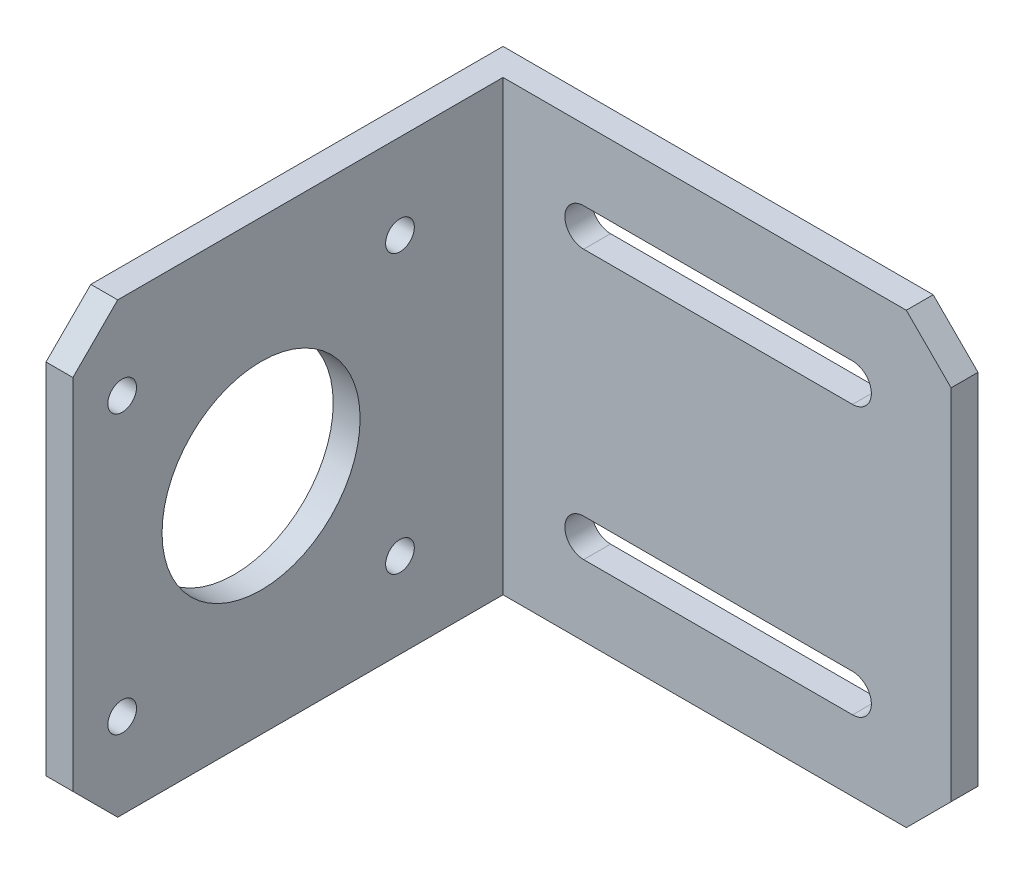
ISO-10303-21;
HEADER;
FILE_DESCRIPTION(('STEP AP214'),'2;1');
FILE_NAME('part.step','',(''),(''),'','','');
FILE_SCHEMA(('AUTOMOTIVE_DESIGN { 1 0 10303 214 1 1 1 1 }'));
ENDSEC;
DATA;
#1=APPLICATION_CONTEXT('core data for automotive mechanical design processes');
#2=APPLICATION_PROTOCOL_DEFINITION('international standard','automotive_design',2000,#1);
#3=PRODUCT_CONTEXT('',#1,'mechanical');
#4=PRODUCT('Part','Part','',(#3));
#5=PRODUCT_RELATED_PRODUCT_CATEGORY('part','',(#4));
#6=PRODUCT_DEFINITION_FORMATION('','',#4);
#7=PRODUCT_DEFINITION_CONTEXT('part definition',#1,'design');
#8=PRODUCT_DEFINITION('design','',#6,#7);
#9=PRODUCT_DEFINITION_SHAPE('','',#8);
#10=(LENGTH_UNIT() NAMED_UNIT(*) SI_UNIT(.MILLI.,.METRE.));
#11=(NAMED_UNIT(*) PLANE_ANGLE_UNIT() SI_UNIT($,.RADIAN.));
#12=(NAMED_UNIT(*) SI_UNIT($,.STERADIAN.) SOLID_ANGLE_UNIT());
#13=UNCERTAINTY_MEASURE_WITH_UNIT(LENGTH_MEASURE(1.E-05),#10,'distance_accuracy_value','');
#14=(GEOMETRIC_REPRESENTATION_CONTEXT(3) GLOBAL_UNCERTAINTY_ASSIGNED_CONTEXT((#13)) GLOBAL_UNIT_ASSIGNED_CONTEXT((#10,
#11,#12)) REPRESENTATION_CONTEXT('',''));
#15=CARTESIAN_POINT('',(0.,0.,0.));
#16=DIRECTION('',(0.,0.,1.));
#17=DIRECTION('',(1.,0.,0.));
#18=AXIS2_PLACEMENT_3D('',#15,#16,#17);
#19=CARTESIAN_POINT('',(0.,0.,3.));
#20=DIRECTION('',(0.,0.,-1.));
#21=DIRECTION('',(-1.,0.,0.));
#22=AXIS2_PLACEMENT_3D('',#19,#20,#21);
#23=PLANE('',#22);
#24=CARTESIAN_POINT('',(12.,10.,3.));
#25=DIRECTION('',(0.,0.,1.));
#26=DIRECTION('',(-1.,0.,0.));
#27=AXIS2_PLACEMENT_3D('',#24,#25,#26);
#28=CIRCLE('',#27,2.1);
#29=CARTESIAN_POINT('',(12.,12.1,3.));
#30=VERTEX_POINT('',#29);
#31=CARTESIAN_POINT('',(12.,7.9,3.));
#32=VERTEX_POINT('',#31);
#33=EDGE_CURVE('E168',#30,#32,#28,.T.);
#34=ORIENTED_EDGE('',*,*,#33,.F.);
#35=DIRECTION('',(-1.,0.,0.));
#36=VECTOR('',#35,1.);
#37=CARTESIAN_POINT('',(12.,12.1,3.));
#38=LINE('',#37,#36);
#39=CARTESIAN_POINT('',(42.,12.1,3.));
#40=VERTEX_POINT('',#39);
#41=EDGE_CURVE('E194',#40,#30,#38,.T.);
#42=ORIENTED_EDGE('',*,*,#41,.F.);
#43=CARTESIAN_POINT('',(42.,10.,3.));
#44=DIRECTION('',(0.,0.,1.));
#45=DIRECTION('',(-1.,0.,0.));
#46=AXIS2_PLACEMENT_3D('',#43,#44,#45);
#47=CIRCLE('',#46,2.1);
#48=CARTESIAN_POINT('',(42.,7.9,3.));
#49=VERTEX_POINT('',#48);
#50=EDGE_CURVE('E192',#49,#40,#47,.T.);
#51=ORIENTED_EDGE('',*,*,#50,.F.);
#52=DIRECTION('',(1.,0.,0.));
#53=VECTOR('',#52,1.);
#54=CARTESIAN_POINT('',(12.,7.9,3.));
#55=LINE('',#54,#53);
#56=EDGE_CURVE('E178',#32,#49,#55,.T.);
#57=ORIENTED_EDGE('',*,*,#56,.F.);
#58=EDGE_LOOP('',(#34,#42,#51,#57));
#59=FACE_BOUND('',#58,.T.);
#60=CARTESIAN_POINT('',(12.,40.,3.));
#61=DIRECTION('',(0.,0.,1.));
#62=DIRECTION('',(1.,0.,0.));
#63=AXIS2_PLACEMENT_3D('',#60,#61,#62);
#64=CIRCLE('',#63,2.1);
#65=CARTESIAN_POINT('',(12.,42.1,3.));
#66=VERTEX_POINT('',#65);
#67=CARTESIAN_POINT('',(12.,37.9,3.));
#68=VERTEX_POINT('',#67);
#69=EDGE_CURVE('E212',#66,#68,#64,.T.);
#70=ORIENTED_EDGE('',*,*,#69,.F.);
#71=DIRECTION('',(-1.,0.,0.));
#72=VECTOR('',#71,1.);
#73=CARTESIAN_POINT('',(12.,42.1,3.));
#74=LINE('',#73,#72);
#75=CARTESIAN_POINT('',(42.,42.1,3.));
#76=VERTEX_POINT('',#75);
#77=EDGE_CURVE('E220',#76,#66,#74,.T.);
#78=ORIENTED_EDGE('',*,*,#77,.F.);
#79=CARTESIAN_POINT('',(42.,40.,3.));
#80=DIRECTION('',(0.,0.,1.));
#81=DIRECTION('',(1.,0.,0.));
#82=AXIS2_PLACEMENT_3D('',#79,#80,#81);
#83=CIRCLE('',#82,2.1);
#84=CARTESIAN_POINT('',(42.,37.9,3.));
#85=VERTEX_POINT('',#84);
#86=EDGE_CURVE('E217',#85,#76,#83,.T.);
#87=ORIENTED_EDGE('',*,*,#86,.F.);
#88=DIRECTION('',(1.,0.,0.));
#89=VECTOR('',#88,1.);
#90=CARTESIAN_POINT('',(12.,37.9,3.));
#91=LINE('',#90,#89);
#92=EDGE_CURVE('E214',#68,#85,#91,.T.);
#93=ORIENTED_EDGE('',*,*,#92,.F.);
#94=EDGE_LOOP('',(#70,#78,#87,#93));
#95=FACE_BOUND('',#94,.T.);
#96=DIRECTION('',(0.,1.,0.));
#97=VECTOR('',#96,1.);
#98=CARTESIAN_POINT('',(53.,0.,3.));
#99=LINE('',#98,#97);
#100=CARTESIAN_POINT('',(53.,4.99999999999999,3.));
#101=VERTEX_POINT('',#100);
#102=CARTESIAN_POINT('',(53.,45.,3.));
#103=VERTEX_POINT('',#102);
#104=EDGE_CURVE('E246',#101,#103,#99,.T.);
#105=ORIENTED_EDGE('',*,*,#104,.T.);
#106=DIRECTION('',(0.707106781186547,-0.707106781186549,0.));
#107=VECTOR('',#106,1.);
#108=CARTESIAN_POINT('',(48.,50.,3.));
#109=LINE('',#108,#107);
#110=CARTESIAN_POINT('',(48.,50.,3.));
#111=VERTEX_POINT('',#110);
#112=EDGE_CURVE('E282',#103,#111,#109,.F.);
#113=ORIENTED_EDGE('',*,*,#112,.T.);
#114=DIRECTION('',(-1.,0.,0.));
#115=VECTOR('',#114,1.);
#116=CARTESIAN_POINT('',(0.,50.,3.));
#117=LINE('',#116,#115);
#118=CARTESIAN_POINT('',(3.,50.,3.));
#119=VERTEX_POINT('',#118);
#120=EDGE_CURVE('E250',#111,#119,#117,.T.);
#121=ORIENTED_EDGE('',*,*,#120,.T.);
#122=DIRECTION('',(0.,1.,0.));
#123=VECTOR('',#122,1.);
#124=CARTESIAN_POINT('',(3.,0.,3.));
#125=LINE('',#124,#123);
#126=CARTESIAN_POINT('',(3.,0.,3.));
#127=VERTEX_POINT('',#126);
#128=EDGE_CURVE('E201',#127,#119,#125,.T.);
#129=ORIENTED_EDGE('',*,*,#128,.F.);
#130=DIRECTION('',(1.,0.,0.));
#131=VECTOR('',#130,1.);
#132=CARTESIAN_POINT('',(0.,0.,3.));
#133=LINE('',#132,#131);
#134=CARTESIAN_POINT('',(48.,0.,3.));
#135=VERTEX_POINT('',#134);
#136=EDGE_CURVE('E243',#127,#135,#133,.T.);
#137=ORIENTED_EDGE('',*,*,#136,.T.);
#138=DIRECTION('',(-0.707106781186549,-0.707106781186547,0.));
#139=VECTOR('',#138,1.);
#140=CARTESIAN_POINT('',(53.,4.99999999999999,3.));
#141=LINE('',#140,#139);
#142=EDGE_CURVE('E280',#135,#101,#141,.F.);
#143=ORIENTED_EDGE('',*,*,#142,.T.);
#144=EDGE_LOOP('',(#105,#113,#121,#129,#137,#143));
#145=FACE_BOUND('',#144,.T.);
#146=ADVANCED_FACE('F41',(#59,#95,#145),#23,.F.);
#147=CARTESIAN_POINT('',(0.,0.,0.));
#148=DIRECTION('',(0.,0.,-1.));
#149=DIRECTION('',(-1.,0.,0.));
#150=AXIS2_PLACEMENT_3D('',#147,#148,#149);
#151=PLANE('',#150);
#152=DIRECTION('',(-1.,0.,0.));
#153=VECTOR('',#152,1.);
#154=CARTESIAN_POINT('',(0.,50.,0.));
#155=LINE('',#154,#153);
#156=CARTESIAN_POINT('',(48.,50.,0.));
#157=VERTEX_POINT('',#156);
#158=CARTESIAN_POINT('',(0.,50.,0.));
#159=VERTEX_POINT('',#158);
#160=EDGE_CURVE('E247',#157,#159,#155,.T.);
#161=ORIENTED_EDGE('',*,*,#160,.F.);
#162=DIRECTION('',(-0.707106781186547,0.707106781186549,0.));
#163=VECTOR('',#162,1.);
#164=CARTESIAN_POINT('',(49.0000000000001,48.9999999999999,0.));
#165=LINE('',#164,#163);
#166=CARTESIAN_POINT('',(53.,45.,0.));
#167=VERTEX_POINT('',#166);
#168=EDGE_CURVE('E273',#157,#167,#165,.F.);
#169=ORIENTED_EDGE('',*,*,#168,.T.);
#170=DIRECTION('',(0.,1.,0.));
#171=VECTOR('',#170,1.);
#172=CARTESIAN_POINT('',(53.,0.,0.));
#173=LINE('',#172,#171);
#174=CARTESIAN_POINT('',(53.,4.99999999999999,0.));
#175=VERTEX_POINT('',#174);
#176=EDGE_CURVE('E258',#175,#167,#173,.T.);
#177=ORIENTED_EDGE('',*,*,#176,.F.);
#178=DIRECTION('',(0.707106781186549,0.707106781186547,0.));
#179=VECTOR('',#178,1.);
#180=CARTESIAN_POINT('',(23.9999999999999,-24.,0.));
#181=LINE('',#180,#179);
#182=CARTESIAN_POINT('',(48.,0.,0.));
#183=VERTEX_POINT('',#182);
#184=EDGE_CURVE('E271',#175,#183,#181,.F.);
#185=ORIENTED_EDGE('',*,*,#184,.T.);
#186=DIRECTION('',(1.,0.,0.));
#187=VECTOR('',#186,1.);
#188=CARTESIAN_POINT('',(0.,0.,0.));
#189=LINE('',#188,#187);
#190=CARTESIAN_POINT('',(0.,0.,0.));
#191=VERTEX_POINT('',#190);
#192=EDGE_CURVE('E255',#191,#183,#189,.T.);
#193=ORIENTED_EDGE('',*,*,#192,.F.);
#194=DIRECTION('',(0.,-1.,0.));
#195=VECTOR('',#194,1.);
#196=CARTESIAN_POINT('',(0.,0.,0.));
#197=LINE('',#196,#195);
#198=EDGE_CURVE('E242',#159,#191,#197,.T.);
#199=ORIENTED_EDGE('',*,*,#198,.F.);
#200=EDGE_LOOP('',(#161,#169,#177,#185,#193,#199));
#201=FACE_BOUND('',#200,.T.);
#202=DIRECTION('',(-1.,0.,0.));
#203=VECTOR('',#202,1.);
#204=CARTESIAN_POINT('',(12.,42.1,0.));
#205=LINE('',#204,#203);
#206=CARTESIAN_POINT('',(42.,42.1,0.));
#207=VERTEX_POINT('',#206);
#208=CARTESIAN_POINT('',(12.,42.1,0.));
#209=VERTEX_POINT('',#208);
#210=EDGE_CURVE('E215',#207,#209,#205,.T.);
#211=ORIENTED_EDGE('',*,*,#210,.T.);
#212=CARTESIAN_POINT('',(12.,40.,0.));
#213=DIRECTION('',(0.,0.,1.));
#214=DIRECTION('',(1.,0.,0.));
#215=AXIS2_PLACEMENT_3D('',#212,#213,#214);
#216=CIRCLE('',#215,2.1);
#217=CARTESIAN_POINT('',(12.,37.9,0.));
#218=VERTEX_POINT('',#217);
#219=EDGE_CURVE('E186',#209,#218,#216,.T.);
#220=ORIENTED_EDGE('',*,*,#219,.T.);
#221=DIRECTION('',(1.,0.,0.));
#222=VECTOR('',#221,1.);
#223=CARTESIAN_POINT('',(12.,37.9,0.));
#224=LINE('',#223,#222);
#225=CARTESIAN_POINT('',(42.,37.9,0.));
#226=VERTEX_POINT('',#225);
#227=EDGE_CURVE('E225',#218,#226,#224,.T.);
#228=ORIENTED_EDGE('',*,*,#227,.T.);
#229=CARTESIAN_POINT('',(42.,40.,0.));
#230=DIRECTION('',(0.,0.,1.));
#231=DIRECTION('',(1.,0.,0.));
#232=AXIS2_PLACEMENT_3D('',#229,#230,#231);
#233=CIRCLE('',#232,2.1);
#234=EDGE_CURVE('E228',#226,#207,#233,.T.);
#235=ORIENTED_EDGE('',*,*,#234,.T.);
#236=EDGE_LOOP('',(#211,#220,#228,#235));
#237=FACE_BOUND('',#236,.T.);
#238=DIRECTION('',(-1.,0.,0.));
#239=VECTOR('',#238,1.);
#240=CARTESIAN_POINT('',(12.,12.1,0.));
#241=LINE('',#240,#239);
#242=CARTESIAN_POINT('',(42.,12.1,0.));
#243=VERTEX_POINT('',#242);
#244=CARTESIAN_POINT('',(12.,12.1,0.));
#245=VERTEX_POINT('',#244);
#246=EDGE_CURVE('E179',#243,#245,#241,.T.);
#247=ORIENTED_EDGE('',*,*,#246,.T.);
#248=CARTESIAN_POINT('',(12.,10.,0.));
#249=DIRECTION('',(0.,0.,1.));
#250=DIRECTION('',(-1.,0.,0.));
#251=AXIS2_PLACEMENT_3D('',#248,#249,#250);
#252=CIRCLE('',#251,2.1);
#253=CARTESIAN_POINT('',(12.,7.9,0.));
#254=VERTEX_POINT('',#253);
#255=EDGE_CURVE('E199',#245,#254,#252,.T.);
#256=ORIENTED_EDGE('',*,*,#255,.T.);
#257=DIRECTION('',(1.,0.,0.));
#258=VECTOR('',#257,1.);
#259=CARTESIAN_POINT('',(12.,7.9,0.));
#260=LINE('',#259,#258);
#261=CARTESIAN_POINT('',(42.,7.9,0.));
#262=VERTEX_POINT('',#261);
#263=EDGE_CURVE('E185',#254,#262,#260,.T.);
#264=ORIENTED_EDGE('',*,*,#263,.T.);
#265=CARTESIAN_POINT('',(42.,10.,0.));
#266=DIRECTION('',(0.,0.,1.));
#267=DIRECTION('',(-1.,0.,0.));
#268=AXIS2_PLACEMENT_3D('',#265,#266,#267);
#269=CIRCLE('',#268,2.1);
#270=EDGE_CURVE('E203',#262,#243,#269,.T.);
#271=ORIENTED_EDGE('',*,*,#270,.T.);
#272=EDGE_LOOP('',(#247,#256,#264,#271));
#273=FACE_BOUND('',#272,.T.);
#274=ADVANCED_FACE('F364',(#201,#237,#273),#151,.T.);
#275=CARTESIAN_POINT('',(0.,0.,3.));
#276=DIRECTION('',(1.,0.,0.));
#277=DIRECTION('',(0.,0.,-1.));
#278=AXIS2_PLACEMENT_3D('',#275,#276,#277);
#279=PLANE('',#278);
#280=DIRECTION('',(0.,0.,-1.));
#281=VECTOR('',#280,1.);
#282=CARTESIAN_POINT('',(0.,0.,3.));
#283=LINE('',#282,#281);
#284=CARTESIAN_POINT('',(0.,0.,46.));
#285=VERTEX_POINT('',#284);
#286=EDGE_CURVE('E264',#285,#191,#283,.T.);
#287=ORIENTED_EDGE('',*,*,#286,.F.);
#288=DIRECTION('',(0.,0.707106781186549,0.707106781186547));
#289=VECTOR('',#288,1.);
#290=CARTESIAN_POINT('',(0.,0.,46.));
#291=LINE('',#290,#289);
#292=CARTESIAN_POINT('',(0.,5.00000000000003,51.));
#293=VERTEX_POINT('',#292);
#294=EDGE_CURVE('E291',#285,#293,#291,.T.);
#295=ORIENTED_EDGE('',*,*,#294,.T.);
#296=DIRECTION('',(0.,1.,0.));
#297=VECTOR('',#296,1.);
#298=CARTESIAN_POINT('',(0.,50.,51.));
#299=LINE('',#298,#297);
#300=CARTESIAN_POINT('',(0.,45.,51.));
#301=VERTEX_POINT('',#300);
#302=EDGE_CURVE('E299',#293,#301,#299,.T.);
#303=ORIENTED_EDGE('',*,*,#302,.T.);
#304=DIRECTION('',(0.,0.707106781186546,-0.707106781186549));
#305=VECTOR('',#304,1.);
#306=CARTESIAN_POINT('',(0.,45.,51.));
#307=LINE('',#306,#305);
#308=CARTESIAN_POINT('',(0.,50.,46.));
#309=VERTEX_POINT('',#308);
#310=EDGE_CURVE('E289',#301,#309,#307,.T.);
#311=ORIENTED_EDGE('',*,*,#310,.T.);
#312=DIRECTION('',(0.,0.,-1.));
#313=VECTOR('',#312,1.);
#314=CARTESIAN_POINT('',(0.,50.,3.));
#315=LINE('',#314,#313);
#316=EDGE_CURVE('E252',#309,#159,#315,.T.);
#317=ORIENTED_EDGE('',*,*,#316,.T.);
#318=ORIENTED_EDGE('',*,*,#198,.T.);
#319=EDGE_LOOP('',(#287,#295,#303,#311,#317,#318));
#320=FACE_BOUND('',#319,.T.);
#321=CARTESIAN_POINT('',(0.,25.,30.));
#322=DIRECTION('',(-1.,0.,0.));
#323=DIRECTION('',(0.,0.,1.));
#324=AXIS2_PLACEMENT_3D('',#321,#322,#323);
#325=CIRCLE('',#324,11.05);
#326=CARTESIAN_POINT('',(0.,25.,41.05));
#327=VERTEX_POINT('',#326);
#328=EDGE_CURVE('E313',#327,#327,#325,.T.);
#329=ORIENTED_EDGE('',*,*,#328,.F.);
#330=EDGE_LOOP('',(#329));
#331=FACE_BOUND('',#330,.T.);
#332=CARTESIAN_POINT('',(0.,40.5,45.5));
#333=DIRECTION('',(-1.,0.,0.));
#334=DIRECTION('',(0.,0.,1.));
#335=AXIS2_PLACEMENT_3D('',#332,#333,#334);
#336=CIRCLE('',#335,1.6);
#337=CARTESIAN_POINT('',(0.,40.5,47.1));
#338=VERTEX_POINT('',#337);
#339=EDGE_CURVE('E327',#338,#338,#336,.T.);
#340=ORIENTED_EDGE('',*,*,#339,.F.);
#341=EDGE_LOOP('',(#340));
#342=FACE_BOUND('',#341,.T.);
#343=CARTESIAN_POINT('',(0.,9.49999999999996,45.5000000000004));
#344=DIRECTION('',(-1.,0.,0.));
#345=DIRECTION('',(0.,0.,1.));
#346=AXIS2_PLACEMENT_3D('',#343,#344,#345);
#347=CIRCLE('',#346,1.6);
#348=CARTESIAN_POINT('',(0.,9.49999999999996,47.1000000000004));
#349=VERTEX_POINT('',#348);
#350=EDGE_CURVE('E333',#349,#349,#347,.T.);
#351=ORIENTED_EDGE('',*,*,#350,.F.);
#352=EDGE_LOOP('',(#351));
#353=FACE_BOUND('',#352,.T.);
#354=CARTESIAN_POINT('',(0.,9.49999999999968,14.5000000000003));
#355=DIRECTION('',(-1.,0.,0.));
#356=DIRECTION('',(0.,0.,1.));
#357=AXIS2_PLACEMENT_3D('',#354,#355,#356);
#358=CIRCLE('',#357,1.6);
#359=CARTESIAN_POINT('',(0.,9.49999999999968,16.1000000000003));
#360=VERTEX_POINT('',#359);
#361=EDGE_CURVE('E339',#360,#360,#358,.T.);
#362=ORIENTED_EDGE('',*,*,#361,.F.);
#363=EDGE_LOOP('',(#362));
#364=FACE_BOUND('',#363,.T.);
#365=CARTESIAN_POINT('',(0.,40.4999999999997,14.5000000000002));
#366=DIRECTION('',(-1.,0.,0.));
#367=DIRECTION('',(0.,0.,1.));
#368=AXIS2_PLACEMENT_3D('',#365,#366,#367);
#369=CIRCLE('',#368,1.6);
#370=CARTESIAN_POINT('',(0.,40.4999999999997,16.1000000000002));
#371=VERTEX_POINT('',#370);
#372=EDGE_CURVE('E345',#371,#371,#369,.T.);
#373=ORIENTED_EDGE('',*,*,#372,.F.);
#374=EDGE_LOOP('',(#373));
#375=FACE_BOUND('',#374,.T.);
#376=ADVANCED_FACE('F304',(#320,#331,#342,#353,#364,#375),#279,.F.);
#377=CARTESIAN_POINT('',(0.,0.,3.));
#378=DIRECTION('',(0.,1.,0.));
#379=DIRECTION('',(0.,0.,1.));
#380=AXIS2_PLACEMENT_3D('',#377,#378,#379);
#381=PLANE('',#380);
#382=ORIENTED_EDGE('',*,*,#192,.T.);
#383=DIRECTION('',(0.,0.,1.));
#384=VECTOR('',#383,1.);
#385=CARTESIAN_POINT('',(48.,0.,3.));
#386=LINE('',#385,#384);
#387=EDGE_CURVE('E287',#183,#135,#386,.T.);
#388=ORIENTED_EDGE('',*,*,#387,.T.);
#389=ORIENTED_EDGE('',*,*,#136,.F.);
#390=DIRECTION('',(0.,0.,1.));
#391=VECTOR('',#390,1.);
#392=CARTESIAN_POINT('',(3.,0.,0.));
#393=LINE('',#392,#391);
#394=CARTESIAN_POINT('',(3.,0.,46.));
#395=VERTEX_POINT('',#394);
#396=EDGE_CURVE('E307',#127,#395,#393,.T.);
#397=ORIENTED_EDGE('',*,*,#396,.T.);
#398=DIRECTION('',(-1.,0.,0.));
#399=VECTOR('',#398,1.);
#400=CARTESIAN_POINT('',(0.,0.,46.));
#401=LINE('',#400,#399);
#402=EDGE_CURVE('E284',#395,#285,#401,.T.);
#403=ORIENTED_EDGE('',*,*,#402,.T.);
#404=ORIENTED_EDGE('',*,*,#286,.T.);
#405=EDGE_LOOP('',(#382,#388,#389,#397,#403,#404));
#406=FACE_BOUND('',#405,.T.);
#407=ADVANCED_FACE('F363',(#406),#381,.F.);
#408=CARTESIAN_POINT('',(53.,0.,3.));
#409=DIRECTION('',(-1.,0.,0.));
#410=DIRECTION('',(0.,0.,1.));
#411=AXIS2_PLACEMENT_3D('',#408,#409,#410);
#412=PLANE('',#411);
#413=ORIENTED_EDGE('',*,*,#176,.T.);
#414=DIRECTION('',(0.,0.,1.));
#415=VECTOR('',#414,1.);
#416=CARTESIAN_POINT('',(53.,45.,3.));
#417=LINE('',#416,#415);
#418=EDGE_CURVE('E278',#167,#103,#417,.T.);
#419=ORIENTED_EDGE('',*,*,#418,.T.);
#420=ORIENTED_EDGE('',*,*,#104,.F.);
#421=DIRECTION('',(0.,0.,-1.));
#422=VECTOR('',#421,1.);
#423=CARTESIAN_POINT('',(53.,4.99999999999999,3.));
#424=LINE('',#423,#422);
#425=EDGE_CURVE('E275',#101,#175,#424,.T.);
#426=ORIENTED_EDGE('',*,*,#425,.T.);
#427=EDGE_LOOP('',(#413,#419,#420,#426));
#428=FACE_BOUND('',#427,.T.);
#429=ADVANCED_FACE('F370',(#428),#412,.F.);
#430=CARTESIAN_POINT('',(0.,50.,3.));
#431=DIRECTION('',(0.,-1.,0.));
#432=DIRECTION('',(0.,0.,-1.));
#433=AXIS2_PLACEMENT_3D('',#430,#431,#432);
#434=PLANE('',#433);
#435=ORIENTED_EDGE('',*,*,#120,.F.);
#436=DIRECTION('',(0.,0.,-1.));
#437=VECTOR('',#436,1.);
#438=CARTESIAN_POINT('',(48.,50.,3.));
#439=LINE('',#438,#437);
#440=EDGE_CURVE('E268',#111,#157,#439,.T.);
#441=ORIENTED_EDGE('',*,*,#440,.T.);
#442=ORIENTED_EDGE('',*,*,#160,.T.);
#443=ORIENTED_EDGE('',*,*,#316,.F.);
#444=DIRECTION('',(1.,0.,0.));
#445=VECTOR('',#444,1.);
#446=CARTESIAN_POINT('',(3.,50.,46.));
#447=LINE('',#446,#445);
#448=CARTESIAN_POINT('',(3.,50.,46.));
#449=VERTEX_POINT('',#448);
#450=EDGE_CURVE('E266',#309,#449,#447,.T.);
#451=ORIENTED_EDGE('',*,*,#450,.T.);
#452=DIRECTION('',(0.,0.,-1.));
#453=VECTOR('',#452,1.);
#454=CARTESIAN_POINT('',(3.,50.,0.));
#455=LINE('',#454,#453);
#456=EDGE_CURVE('E316',#449,#119,#455,.T.);
#457=ORIENTED_EDGE('',*,*,#456,.T.);
#458=EDGE_LOOP('',(#435,#441,#442,#443,#451,#457));
#459=FACE_BOUND('',#458,.T.);
#460=ADVANCED_FACE('F384',(#459),#434,.F.);
#461=CARTESIAN_POINT('',(12.,40.,3.));
#462=DIRECTION('',(0.,0.,-1.));
#463=DIRECTION('',(-1.,0.,0.));
#464=AXIS2_PLACEMENT_3D('',#461,#462,#463);
#465=CYLINDRICAL_SURFACE('',#464,2.1);
#466=ORIENTED_EDGE('',*,*,#219,.F.);
#467=DIRECTION('',(0.,0.,-1.));
#468=VECTOR('',#467,1.);
#469=CARTESIAN_POINT('',(12.,42.1,3.));
#470=LINE('',#469,#468);
#471=EDGE_CURVE('E222',#66,#209,#470,.T.);
#472=ORIENTED_EDGE('',*,*,#471,.F.);
#473=ORIENTED_EDGE('',*,*,#69,.T.);
#474=DIRECTION('',(0.,0.,-1.));
#475=VECTOR('',#474,1.);
#476=CARTESIAN_POINT('',(12.,37.9,3.));
#477=LINE('',#476,#475);
#478=EDGE_CURVE('E239',#68,#218,#477,.T.);
#479=ORIENTED_EDGE('',*,*,#478,.T.);
#480=EDGE_LOOP('',(#466,#472,#473,#479));
#481=FACE_BOUND('',#480,.T.);
#482=ADVANCED_FACE('F381',(#481),#465,.F.);
#483=CARTESIAN_POINT('',(12.,37.9,3.));
#484=DIRECTION('',(0.,1.,0.));
#485=DIRECTION('',(0.,0.,1.));
#486=AXIS2_PLACEMENT_3D('',#483,#484,#485);
#487=PLANE('',#486);
#488=ORIENTED_EDGE('',*,*,#227,.F.);
#489=ORIENTED_EDGE('',*,*,#478,.F.);
#490=ORIENTED_EDGE('',*,*,#92,.T.);
#491=DIRECTION('',(0.,0.,-1.));
#492=VECTOR('',#491,1.);
#493=CARTESIAN_POINT('',(42.,37.9,3.));
#494=LINE('',#493,#492);
#495=EDGE_CURVE('E237',#85,#226,#494,.T.);
#496=ORIENTED_EDGE('',*,*,#495,.T.);
#497=EDGE_LOOP('',(#488,#489,#490,#496));
#498=FACE_BOUND('',#497,.T.);
#499=ADVANCED_FACE('F554',(#498),#487,.T.);
#500=CARTESIAN_POINT('',(42.,40.,3.));
#501=DIRECTION('',(0.,0.,-1.));
#502=DIRECTION('',(-1.,0.,0.));
#503=AXIS2_PLACEMENT_3D('',#500,#501,#502);
#504=CYLINDRICAL_SURFACE('',#503,2.1);
#505=ORIENTED_EDGE('',*,*,#234,.F.);
#506=ORIENTED_EDGE('',*,*,#495,.F.);
#507=ORIENTED_EDGE('',*,*,#86,.T.);
#508=DIRECTION('',(0.,0.,-1.));
#509=VECTOR('',#508,1.);
#510=CARTESIAN_POINT('',(42.,42.1,3.));
#511=LINE('',#510,#509);
#512=EDGE_CURVE('E235',#76,#207,#511,.T.);
#513=ORIENTED_EDGE('',*,*,#512,.T.);
#514=EDGE_LOOP('',(#505,#506,#507,#513));
#515=FACE_BOUND('',#514,.T.);
#516=ADVANCED_FACE('F545',(#515),#504,.F.);
#517=CARTESIAN_POINT('',(12.,42.1,3.));
#518=DIRECTION('',(0.,-1.,0.));
#519=DIRECTION('',(0.,0.,-1.));
#520=AXIS2_PLACEMENT_3D('',#517,#518,#519);
#521=PLANE('',#520);
#522=ORIENTED_EDGE('',*,*,#210,.F.);
#523=ORIENTED_EDGE('',*,*,#512,.F.);
#524=ORIENTED_EDGE('',*,*,#77,.T.);
#525=ORIENTED_EDGE('',*,*,#471,.T.);
#526=EDGE_LOOP('',(#522,#523,#524,#525));
#527=FACE_BOUND('',#526,.T.);
#528=ADVANCED_FACE('F537',(#527),#521,.T.);
#529=CARTESIAN_POINT('',(12.,10.,3.));
#530=DIRECTION('',(0.,0.,-1.));
#531=DIRECTION('',(-1.,0.,0.));
#532=AXIS2_PLACEMENT_3D('',#529,#530,#531);
#533=CYLINDRICAL_SURFACE('',#532,2.1);
#534=ORIENTED_EDGE('',*,*,#255,.F.);
#535=DIRECTION('',(0.,0.,-1.));
#536=VECTOR('',#535,1.);
#537=CARTESIAN_POINT('',(12.,12.1,3.));
#538=LINE('',#537,#536);
#539=EDGE_CURVE('E174',#30,#245,#538,.T.);
#540=ORIENTED_EDGE('',*,*,#539,.F.);
#541=ORIENTED_EDGE('',*,*,#33,.T.);
#542=DIRECTION('',(0.,0.,-1.));
#543=VECTOR('',#542,1.);
#544=CARTESIAN_POINT('',(12.,7.9,3.));
#545=LINE('',#544,#543);
#546=EDGE_CURVE('E171',#32,#254,#545,.T.);
#547=ORIENTED_EDGE('',*,*,#546,.T.);
#548=EDGE_LOOP('',(#534,#540,#541,#547));
#549=FACE_BOUND('',#548,.T.);
#550=ADVANCED_FACE('F170',(#549),#533,.F.);
#551=CARTESIAN_POINT('',(12.,7.9,3.));
#552=DIRECTION('',(0.,1.,0.));
#553=DIRECTION('',(0.,0.,1.));
#554=AXIS2_PLACEMENT_3D('',#551,#552,#553);
#555=PLANE('',#554);
#556=ORIENTED_EDGE('',*,*,#263,.F.);
#557=ORIENTED_EDGE('',*,*,#546,.F.);
#558=ORIENTED_EDGE('',*,*,#56,.T.);
#559=DIRECTION('',(0.,0.,-1.));
#560=VECTOR('',#559,1.);
#561=CARTESIAN_POINT('',(42.,7.9,3.));
#562=LINE('',#561,#560);
#563=EDGE_CURVE('E187',#49,#262,#562,.T.);
#564=ORIENTED_EDGE('',*,*,#563,.T.);
#565=EDGE_LOOP('',(#556,#557,#558,#564));
#566=FACE_BOUND('',#565,.T.);
#567=ADVANCED_FACE('F182',(#566),#555,.T.);
#568=CARTESIAN_POINT('',(42.,10.,3.));
#569=DIRECTION('',(0.,0.,-1.));
#570=DIRECTION('',(-1.,0.,0.));
#571=AXIS2_PLACEMENT_3D('',#568,#569,#570);
#572=CYLINDRICAL_SURFACE('',#571,2.1);
#573=ORIENTED_EDGE('',*,*,#270,.F.);
#574=ORIENTED_EDGE('',*,*,#563,.F.);
#575=ORIENTED_EDGE('',*,*,#50,.T.);
#576=DIRECTION('',(0.,0.,-1.));
#577=VECTOR('',#576,1.);
#578=CARTESIAN_POINT('',(42.,12.1,3.));
#579=LINE('',#578,#577);
#580=EDGE_CURVE('E209',#40,#243,#579,.T.);
#581=ORIENTED_EDGE('',*,*,#580,.T.);
#582=EDGE_LOOP('',(#573,#574,#575,#581));
#583=FACE_BOUND('',#582,.T.);
#584=ADVANCED_FACE('F513',(#583),#572,.F.);
#585=CARTESIAN_POINT('',(12.,12.1,3.));
#586=DIRECTION('',(0.,-1.,0.));
#587=DIRECTION('',(0.,0.,-1.));
#588=AXIS2_PLACEMENT_3D('',#585,#586,#587);
#589=PLANE('',#588);
#590=ORIENTED_EDGE('',*,*,#246,.F.);
#591=ORIENTED_EDGE('',*,*,#580,.F.);
#592=ORIENTED_EDGE('',*,*,#41,.T.);
#593=ORIENTED_EDGE('',*,*,#539,.T.);
#594=EDGE_LOOP('',(#590,#591,#592,#593));
#595=FACE_BOUND('',#594,.T.);
#596=ADVANCED_FACE('F499',(#595),#589,.T.);
#597=CARTESIAN_POINT('',(3.,0.,0.));
#598=DIRECTION('',(-1.,0.,0.));
#599=DIRECTION('',(0.,0.,1.));
#600=AXIS2_PLACEMENT_3D('',#597,#598,#599);
#601=PLANE('',#600);
#602=CARTESIAN_POINT('',(3.,40.4999999999997,14.5000000000002));
#603=DIRECTION('',(-1.,0.,0.));
#604=DIRECTION('',(0.,0.,1.));
#605=AXIS2_PLACEMENT_3D('',#602,#603,#604);
#606=CIRCLE('',#605,1.6);
#607=CARTESIAN_POINT('',(3.,40.4999999999997,16.1000000000002));
#608=VERTEX_POINT('',#607);
#609=EDGE_CURVE('E342',#608,#608,#606,.T.);
#610=ORIENTED_EDGE('',*,*,#609,.T.);
#611=EDGE_LOOP('',(#610));
#612=FACE_BOUND('',#611,.T.);
#613=CARTESIAN_POINT('',(3.,9.49999999999968,14.5000000000003));
#614=DIRECTION('',(-1.,0.,0.));
#615=DIRECTION('',(0.,0.,1.));
#616=AXIS2_PLACEMENT_3D('',#613,#614,#615);
#617=CIRCLE('',#616,1.6);
#618=CARTESIAN_POINT('',(3.,9.49999999999968,16.1000000000003));
#619=VERTEX_POINT('',#618);
#620=EDGE_CURVE('E336',#619,#619,#617,.T.);
#621=ORIENTED_EDGE('',*,*,#620,.T.);
#622=EDGE_LOOP('',(#621));
#623=FACE_BOUND('',#622,.T.);
#624=CARTESIAN_POINT('',(3.,9.49999999999996,45.5000000000004));
#625=DIRECTION('',(-1.,0.,0.));
#626=DIRECTION('',(0.,0.,1.));
#627=AXIS2_PLACEMENT_3D('',#624,#625,#626);
#628=CIRCLE('',#627,1.6);
#629=CARTESIAN_POINT('',(3.,9.49999999999996,47.1000000000004));
#630=VERTEX_POINT('',#629);
#631=EDGE_CURVE('E330',#630,#630,#628,.T.);
#632=ORIENTED_EDGE('',*,*,#631,.T.);
#633=EDGE_LOOP('',(#632));
#634=FACE_BOUND('',#633,.T.);
#635=CARTESIAN_POINT('',(3.,40.5,45.5));
#636=DIRECTION('',(-1.,0.,0.));
#637=DIRECTION('',(0.,0.,1.));
#638=AXIS2_PLACEMENT_3D('',#635,#636,#637);
#639=CIRCLE('',#638,1.6);
#640=CARTESIAN_POINT('',(3.,40.5,47.1));
#641=VERTEX_POINT('',#640);
#642=EDGE_CURVE('E325',#641,#641,#639,.T.);
#643=ORIENTED_EDGE('',*,*,#642,.T.);
#644=EDGE_LOOP('',(#643));
#645=FACE_BOUND('',#644,.T.);
#646=CARTESIAN_POINT('',(3.,25.,30.));
#647=DIRECTION('',(-1.,0.,0.));
#648=DIRECTION('',(0.,0.,1.));
#649=AXIS2_PLACEMENT_3D('',#646,#647,#648);
#650=CIRCLE('',#649,11.05);
#651=CARTESIAN_POINT('',(3.,25.,41.05));
#652=VERTEX_POINT('',#651);
#653=EDGE_CURVE('E308',#652,#652,#650,.T.);
#654=ORIENTED_EDGE('',*,*,#653,.T.);
#655=EDGE_LOOP('',(#654));
#656=FACE_BOUND('',#655,.T.);
#657=DIRECTION('',(0.,1.,0.));
#658=VECTOR('',#657,1.);
#659=CARTESIAN_POINT('',(3.,50.,51.));
#660=LINE('',#659,#658);
#661=CARTESIAN_POINT('',(3.,5.00000000000003,51.));
#662=VERTEX_POINT('',#661);
#663=CARTESIAN_POINT('',(3.,45.,51.));
#664=VERTEX_POINT('',#663);
#665=EDGE_CURVE('E300',#662,#664,#660,.T.);
#666=ORIENTED_EDGE('',*,*,#665,.F.);
#667=DIRECTION('',(0.,-0.707106781186549,-0.707106781186547));
#668=VECTOR('',#667,1.);
#669=CARTESIAN_POINT('',(3.,0.,46.));
#670=LINE('',#669,#668);
#671=EDGE_CURVE('E11',#662,#395,#670,.T.);
#672=ORIENTED_EDGE('',*,*,#671,.T.);
#673=ORIENTED_EDGE('',*,*,#396,.F.);
#674=ORIENTED_EDGE('',*,*,#128,.T.);
#675=ORIENTED_EDGE('',*,*,#456,.F.);
#676=DIRECTION('',(0.,-0.707106781186546,0.707106781186549));
#677=VECTOR('',#676,1.);
#678=CARTESIAN_POINT('',(3.,45.,51.));
#679=LINE('',#678,#677);
#680=EDGE_CURVE('E50',#449,#664,#679,.T.);
#681=ORIENTED_EDGE('',*,*,#680,.T.);
#682=EDGE_LOOP('',(#666,#672,#673,#674,#675,#681));
#683=FACE_BOUND('',#682,.T.);
#684=ADVANCED_FACE('F351',(#612,#623,#634,#645,#656,#683),#601,.F.);
#685=CARTESIAN_POINT('',(3.,50.,51.));
#686=DIRECTION('',(0.,0.,1.));
#687=DIRECTION('',(0.,-1.,0.));
#688=AXIS2_PLACEMENT_3D('',#685,#686,#687);
#689=PLANE('',#688);
#690=ORIENTED_EDGE('',*,*,#302,.F.);
#691=DIRECTION('',(1.,0.,0.));
#692=VECTOR('',#691,1.);
#693=CARTESIAN_POINT('',(3.,5.00000000000003,51.));
#694=LINE('',#693,#692);
#695=EDGE_CURVE('E63',#293,#662,#694,.T.);
#696=ORIENTED_EDGE('',*,*,#695,.T.);
#697=ORIENTED_EDGE('',*,*,#665,.T.);
#698=DIRECTION('',(-1.,0.,0.));
#699=VECTOR('',#698,1.);
#700=CARTESIAN_POINT('',(0.,45.,51.));
#701=LINE('',#700,#699);
#702=EDGE_CURVE('E293',#664,#301,#701,.T.);
#703=ORIENTED_EDGE('',*,*,#702,.T.);
#704=EDGE_LOOP('',(#690,#696,#697,#703));
#705=FACE_BOUND('',#704,.T.);
#706=ADVANCED_FACE('F298',(#705),#689,.T.);
#707=CARTESIAN_POINT('',(3.,25.,30.));
#708=DIRECTION('',(-1.,0.,0.));
#709=DIRECTION('',(0.,0.,1.));
#710=AXIS2_PLACEMENT_3D('',#707,#708,#709);
#711=CYLINDRICAL_SURFACE('',#710,11.05);
#712=ORIENTED_EDGE('',*,*,#653,.F.);
#713=EDGE_LOOP('',(#712));
#714=FACE_BOUND('',#713,.T.);
#715=ORIENTED_EDGE('',*,*,#328,.T.);
#716=EDGE_LOOP('',(#715));
#717=FACE_BOUND('',#716,.T.);
#718=ADVANCED_FACE('F479',(#714,#717),#711,.F.);
#719=CARTESIAN_POINT('',(3.,40.5,45.5));
#720=DIRECTION('',(-1.,0.,0.));
#721=DIRECTION('',(0.,0.,1.));
#722=AXIS2_PLACEMENT_3D('',#719,#720,#721);
#723=CYLINDRICAL_SURFACE('',#722,1.6);
#724=ORIENTED_EDGE('',*,*,#642,.F.);
#725=EDGE_LOOP('',(#724));
#726=FACE_BOUND('',#725,.T.);
#727=ORIENTED_EDGE('',*,*,#339,.T.);
#728=EDGE_LOOP('',(#727));
#729=FACE_BOUND('',#728,.T.);
#730=ADVANCED_FACE('F470',(#726,#729),#723,.F.);
#731=CARTESIAN_POINT('',(3.,9.49999999999996,45.5000000000004));
#732=DIRECTION('',(-1.,0.,0.));
#733=DIRECTION('',(0.,0.,1.));
#734=AXIS2_PLACEMENT_3D('',#731,#732,#733);
#735=CYLINDRICAL_SURFACE('',#734,1.6);
#736=ORIENTED_EDGE('',*,*,#631,.F.);
#737=EDGE_LOOP('',(#736));
#738=FACE_BOUND('',#737,.T.);
#739=ORIENTED_EDGE('',*,*,#350,.T.);
#740=EDGE_LOOP('',(#739));
#741=FACE_BOUND('',#740,.T.);
#742=ADVANCED_FACE('F461',(#738,#741),#735,.F.);
#743=CARTESIAN_POINT('',(3.,9.49999999999968,14.5000000000003));
#744=DIRECTION('',(-1.,0.,0.));
#745=DIRECTION('',(0.,0.,1.));
#746=AXIS2_PLACEMENT_3D('',#743,#744,#745);
#747=CYLINDRICAL_SURFACE('',#746,1.6);
#748=ORIENTED_EDGE('',*,*,#620,.F.);
#749=EDGE_LOOP('',(#748));
#750=FACE_BOUND('',#749,.T.);
#751=ORIENTED_EDGE('',*,*,#361,.T.);
#752=EDGE_LOOP('',(#751));
#753=FACE_BOUND('',#752,.T.);
#754=ADVANCED_FACE('F358',(#750,#753),#747,.F.);
#755=CARTESIAN_POINT('',(3.,40.4999999999997,14.5000000000002));
#756=DIRECTION('',(-1.,0.,0.));
#757=DIRECTION('',(0.,0.,1.));
#758=AXIS2_PLACEMENT_3D('',#755,#756,#757);
#759=CYLINDRICAL_SURFACE('',#758,1.6);
#760=ORIENTED_EDGE('',*,*,#609,.F.);
#761=EDGE_LOOP('',(#760));
#762=FACE_BOUND('',#761,.T.);
#763=ORIENTED_EDGE('',*,*,#372,.T.);
#764=EDGE_LOOP('',(#763));
#765=FACE_BOUND('',#764,.T.);
#766=ADVANCED_FACE('F354',(#762,#765),#759,.F.);
#767=CARTESIAN_POINT('',(48.,50.,3.));
#768=DIRECTION('',(-0.707106781186549,-0.707106781186547,0.));
#769=DIRECTION('',(0.,0.,-1.));
#770=AXIS2_PLACEMENT_3D('',#767,#768,#769);
#771=PLANE('',#770);
#772=ORIENTED_EDGE('',*,*,#112,.F.);
#773=ORIENTED_EDGE('',*,*,#418,.F.);
#774=ORIENTED_EDGE('',*,*,#168,.F.);
#775=ORIENTED_EDGE('',*,*,#440,.F.);
#776=EDGE_LOOP('',(#772,#773,#774,#775));
#777=FACE_BOUND('',#776,.T.);
#778=ADVANCED_FACE('F357',(#777),#771,.F.);
#779=CARTESIAN_POINT('',(53.,4.99999999999999,3.));
#780=DIRECTION('',(-0.707106781186546,0.707106781186548,0.));
#781=DIRECTION('',(0.,0.,-1.));
#782=AXIS2_PLACEMENT_3D('',#779,#780,#781);
#783=PLANE('',#782);
#784=ORIENTED_EDGE('',*,*,#142,.F.);
#785=ORIENTED_EDGE('',*,*,#387,.F.);
#786=ORIENTED_EDGE('',*,*,#184,.F.);
#787=ORIENTED_EDGE('',*,*,#425,.F.);
#788=EDGE_LOOP('',(#784,#785,#786,#787));
#789=FACE_BOUND('',#788,.T.);
#790=ADVANCED_FACE('F409',(#789),#783,.F.);
#791=CARTESIAN_POINT('',(0.,0.,46.));
#792=DIRECTION('',(0.,-0.707106781186546,0.707106781186548));
#793=DIRECTION('',(1.,0.,0.));
#794=AXIS2_PLACEMENT_3D('',#791,#792,#793);
#795=PLANE('',#794);
#796=ORIENTED_EDGE('',*,*,#671,.F.);
#797=ORIENTED_EDGE('',*,*,#695,.F.);
#798=ORIENTED_EDGE('',*,*,#294,.F.);
#799=ORIENTED_EDGE('',*,*,#402,.F.);
#800=EDGE_LOOP('',(#796,#797,#798,#799));
#801=FACE_BOUND('',#800,.T.);
#802=ADVANCED_FACE('F405',(#801),#795,.T.);
#803=CARTESIAN_POINT('',(3.,45.,51.));
#804=DIRECTION('',(0.,0.707106781186549,0.707106781186545));
#805=DIRECTION('',(1.,0.,0.));
#806=AXIS2_PLACEMENT_3D('',#803,#804,#805);
#807=PLANE('',#806);
#808=ORIENTED_EDGE('',*,*,#680,.F.);
#809=ORIENTED_EDGE('',*,*,#450,.F.);
#810=ORIENTED_EDGE('',*,*,#310,.F.);
#811=ORIENTED_EDGE('',*,*,#702,.F.);
#812=EDGE_LOOP('',(#808,#809,#810,#811));
#813=FACE_BOUND('',#812,.T.);
#814=ADVANCED_FACE('F44',(#813),#807,.T.);
#815=CLOSED_SHELL('',(#146,#274,#376,#407,#429,#460,#482,#499,#516,#528,#550,#567,#584,#596,
#684,#706,#718,#730,#742,#754,#766,#778,#790,#802,#814));
#816=MANIFOLD_SOLID_BREP('B2',#815);
#817=ADVANCED_BREP_SHAPE_REPRESENTATION('',(#18,#816),#14);
#818=SHAPE_DEFINITION_REPRESENTATION(#9,#817);
ENDSEC;
END-ISO-10303-21;
